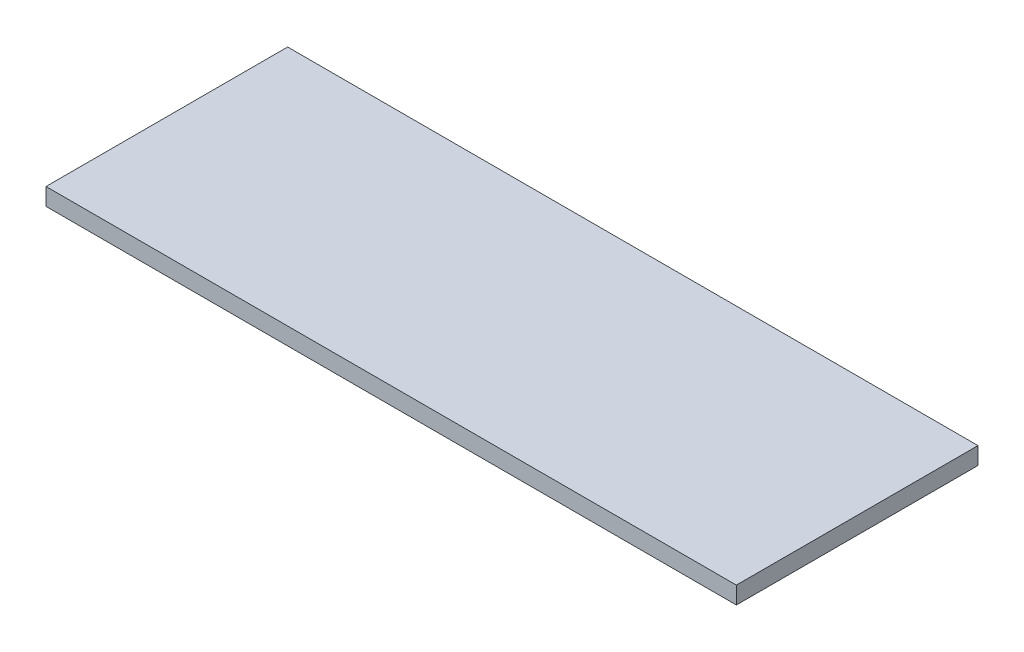
ISO-10303-21;
HEADER;
FILE_DESCRIPTION(('STEP AP214'),'2;1');
FILE_NAME('part.step','',(''),(''),'','','');
FILE_SCHEMA(('AUTOMOTIVE_DESIGN { 1 0 10303 214 1 1 1 1 }'));
ENDSEC;
DATA;
#1=APPLICATION_CONTEXT('core data for automotive mechanical design processes');
#2=APPLICATION_PROTOCOL_DEFINITION('international standard','automotive_design',2000,#1);
#3=PRODUCT_CONTEXT('',#1,'mechanical');
#4=PRODUCT('Part','Part','',(#3));
#5=PRODUCT_RELATED_PRODUCT_CATEGORY('part','',(#4));
#6=PRODUCT_DEFINITION_FORMATION('','',#4);
#7=PRODUCT_DEFINITION_CONTEXT('part definition',#1,'design');
#8=PRODUCT_DEFINITION('design','',#6,#7);
#9=PRODUCT_DEFINITION_SHAPE('','',#8);
#10=(LENGTH_UNIT() NAMED_UNIT(*) SI_UNIT(.MILLI.,.METRE.));
#11=(NAMED_UNIT(*) PLANE_ANGLE_UNIT() SI_UNIT($,.RADIAN.));
#12=(NAMED_UNIT(*) SI_UNIT($,.STERADIAN.) SOLID_ANGLE_UNIT());
#13=UNCERTAINTY_MEASURE_WITH_UNIT(LENGTH_MEASURE(1.E-05),#10,'distance_accuracy_value','');
#14=(GEOMETRIC_REPRESENTATION_CONTEXT(3) GLOBAL_UNCERTAINTY_ASSIGNED_CONTEXT((#13)) GLOBAL_UNIT_ASSIGNED_CONTEXT((#10,
#11,#12)) REPRESENTATION_CONTEXT('',''));
#15=CARTESIAN_POINT('',(0.,0.,0.));
#16=DIRECTION('',(0.,0.,1.));
#17=DIRECTION('',(1.,0.,0.));
#18=AXIS2_PLACEMENT_3D('',#15,#16,#17);
#19=CARTESIAN_POINT('',(-10.,0.5,3.5));
#20=DIRECTION('',(1.,0.,0.));
#21=DIRECTION('',(0.,0.,-1.));
#22=AXIS2_PLACEMENT_3D('',#19,#20,#21);
#23=PLANE('',#22);
#24=DIRECTION('',(0.,0.,1.));
#25=VECTOR('',#24,1.);
#26=CARTESIAN_POINT('',(-10.,0.,3.5));
#27=LINE('',#26,#25);
#28=CARTESIAN_POINT('',(-10.,0.,-3.5));
#29=VERTEX_POINT('',#28);
#30=CARTESIAN_POINT('',(-10.,0.,3.5));
#31=VERTEX_POINT('',#30);
#32=EDGE_CURVE('E102',#29,#31,#27,.T.);
#33=ORIENTED_EDGE('',*,*,#32,.T.);
#34=DIRECTION('',(0.,-1.,0.));
#35=VECTOR('',#34,1.);
#36=CARTESIAN_POINT('',(-10.,0.5,3.5));
#37=LINE('',#36,#35);
#38=CARTESIAN_POINT('',(-10.,0.5,3.5));
#39=VERTEX_POINT('',#38);
#40=EDGE_CURVE('E11',#39,#31,#37,.T.);
#41=ORIENTED_EDGE('',*,*,#40,.F.);
#42=DIRECTION('',(0.,0.,1.));
#43=VECTOR('',#42,1.);
#44=CARTESIAN_POINT('',(-10.,0.5,3.5));
#45=LINE('',#44,#43);
#46=CARTESIAN_POINT('',(-10.,0.5,-3.5));
#47=VERTEX_POINT('',#46);
#48=EDGE_CURVE('E90',#47,#39,#45,.T.);
#49=ORIENTED_EDGE('',*,*,#48,.F.);
#50=DIRECTION('',(0.,-1.,0.));
#51=VECTOR('',#50,1.);
#52=CARTESIAN_POINT('',(-10.,0.5,-3.5));
#53=LINE('',#52,#51);
#54=EDGE_CURVE('E98',#47,#29,#53,.T.);
#55=ORIENTED_EDGE('',*,*,#54,.T.);
#56=EDGE_LOOP('',(#33,#41,#49,#55));
#57=FACE_BOUND('',#56,.T.);
#58=ADVANCED_FACE('F39',(#57),#23,.F.);
#59=CARTESIAN_POINT('',(10.,0.5,3.5));
#60=DIRECTION('',(0.,0.,-1.));
#61=DIRECTION('',(-1.,0.,0.));
#62=AXIS2_PLACEMENT_3D('',#59,#60,#61);
#63=PLANE('',#62);
#64=DIRECTION('',(1.,0.,0.));
#65=VECTOR('',#64,1.);
#66=CARTESIAN_POINT('',(10.,0.,3.5));
#67=LINE('',#66,#65);
#68=CARTESIAN_POINT('',(10.,0.,3.5));
#69=VERTEX_POINT('',#68);
#70=EDGE_CURVE('E94',#31,#69,#67,.T.);
#71=ORIENTED_EDGE('',*,*,#70,.T.);
#72=DIRECTION('',(0.,-1.,0.));
#73=VECTOR('',#72,1.);
#74=CARTESIAN_POINT('',(10.,0.5,3.5));
#75=LINE('',#74,#73);
#76=CARTESIAN_POINT('',(10.,0.5,3.5));
#77=VERTEX_POINT('',#76);
#78=EDGE_CURVE('E47',#77,#69,#75,.T.);
#79=ORIENTED_EDGE('',*,*,#78,.F.);
#80=DIRECTION('',(1.,0.,0.));
#81=VECTOR('',#80,1.);
#82=CARTESIAN_POINT('',(10.,0.5,3.5));
#83=LINE('',#82,#81);
#84=EDGE_CURVE('E85',#39,#77,#83,.T.);
#85=ORIENTED_EDGE('',*,*,#84,.F.);
#86=ORIENTED_EDGE('',*,*,#40,.T.);
#87=EDGE_LOOP('',(#71,#79,#85,#86));
#88=FACE_BOUND('',#87,.T.);
#89=ADVANCED_FACE('F93',(#88),#63,.F.);
#90=CARTESIAN_POINT('',(10.,0.5,3.5));
#91=DIRECTION('',(-1.,0.,0.));
#92=DIRECTION('',(0.,0.,1.));
#93=AXIS2_PLACEMENT_3D('',#90,#91,#92);
#94=PLANE('',#93);
#95=DIRECTION('',(0.,0.,-1.));
#96=VECTOR('',#95,1.);
#97=CARTESIAN_POINT('',(10.,0.,3.5));
#98=LINE('',#97,#96);
#99=CARTESIAN_POINT('',(10.,0.,-3.5));
#100=VERTEX_POINT('',#99);
#101=EDGE_CURVE('E72',#69,#100,#98,.T.);
#102=ORIENTED_EDGE('',*,*,#101,.T.);
#103=DIRECTION('',(0.,-1.,0.));
#104=VECTOR('',#103,1.);
#105=CARTESIAN_POINT('',(10.,0.5,-3.5));
#106=LINE('',#105,#104);
#107=CARTESIAN_POINT('',(10.,0.5,-3.5));
#108=VERTEX_POINT('',#107);
#109=EDGE_CURVE('E95',#108,#100,#106,.T.);
#110=ORIENTED_EDGE('',*,*,#109,.F.);
#111=DIRECTION('',(0.,0.,-1.));
#112=VECTOR('',#111,1.);
#113=CARTESIAN_POINT('',(10.,0.5,3.5));
#114=LINE('',#113,#112);
#115=EDGE_CURVE('E88',#77,#108,#114,.T.);
#116=ORIENTED_EDGE('',*,*,#115,.F.);
#117=ORIENTED_EDGE('',*,*,#78,.T.);
#118=EDGE_LOOP('',(#102,#110,#116,#117));
#119=FACE_BOUND('',#118,.T.);
#120=ADVANCED_FACE('F96',(#119),#94,.F.);
#121=CARTESIAN_POINT('',(10.,0.5,-3.5));
#122=DIRECTION('',(0.,0.,1.));
#123=DIRECTION('',(1.,0.,0.));
#124=AXIS2_PLACEMENT_3D('',#121,#122,#123);
#125=PLANE('',#124);
#126=DIRECTION('',(-1.,0.,0.));
#127=VECTOR('',#126,1.);
#128=CARTESIAN_POINT('',(10.,0.,-3.5));
#129=LINE('',#128,#127);
#130=EDGE_CURVE('E78',#100,#29,#129,.T.);
#131=ORIENTED_EDGE('',*,*,#130,.T.);
#132=ORIENTED_EDGE('',*,*,#54,.F.);
#133=DIRECTION('',(-1.,0.,0.));
#134=VECTOR('',#133,1.);
#135=CARTESIAN_POINT('',(10.,0.5,-3.5));
#136=LINE('',#135,#134);
#137=EDGE_CURVE('E55',#108,#47,#136,.T.);
#138=ORIENTED_EDGE('',*,*,#137,.F.);
#139=ORIENTED_EDGE('',*,*,#109,.T.);
#140=EDGE_LOOP('',(#131,#132,#138,#139));
#141=FACE_BOUND('',#140,.T.);
#142=ADVANCED_FACE('F109',(#141),#125,.F.);
#143=CARTESIAN_POINT('',(0.,0.5,0.));
#144=DIRECTION('',(0.,1.,0.));
#145=DIRECTION('',(0.,0.,1.));
#146=AXIS2_PLACEMENT_3D('',#143,#144,#145);
#147=PLANE('',#146);
#148=ORIENTED_EDGE('',*,*,#48,.T.);
#149=ORIENTED_EDGE('',*,*,#84,.T.);
#150=ORIENTED_EDGE('',*,*,#115,.T.);
#151=ORIENTED_EDGE('',*,*,#137,.T.);
#152=EDGE_LOOP('',(#148,#149,#150,#151));
#153=FACE_BOUND('',#152,.T.);
#154=ADVANCED_FACE('F86',(#153),#147,.T.);
#155=CARTESIAN_POINT('',(0.,0.,0.));
#156=DIRECTION('',(0.,1.,0.));
#157=DIRECTION('',(0.,0.,1.));
#158=AXIS2_PLACEMENT_3D('',#155,#156,#157);
#159=PLANE('',#158);
#160=ORIENTED_EDGE('',*,*,#32,.F.);
#161=ORIENTED_EDGE('',*,*,#130,.F.);
#162=ORIENTED_EDGE('',*,*,#101,.F.);
#163=ORIENTED_EDGE('',*,*,#70,.F.);
#164=EDGE_LOOP('',(#160,#161,#162,#163));
#165=FACE_BOUND('',#164,.T.);
#166=ADVANCED_FACE('F112',(#165),#159,.F.);
#167=CLOSED_SHELL('',(#58,#89,#120,#142,#154,#166));
#168=MANIFOLD_SOLID_BREP('B2',#167);
#169=ADVANCED_BREP_SHAPE_REPRESENTATION('',(#18,#168),#14);
#170=SHAPE_DEFINITION_REPRESENTATION(#9,#169);
ENDSEC;
END-ISO-10303-21;
